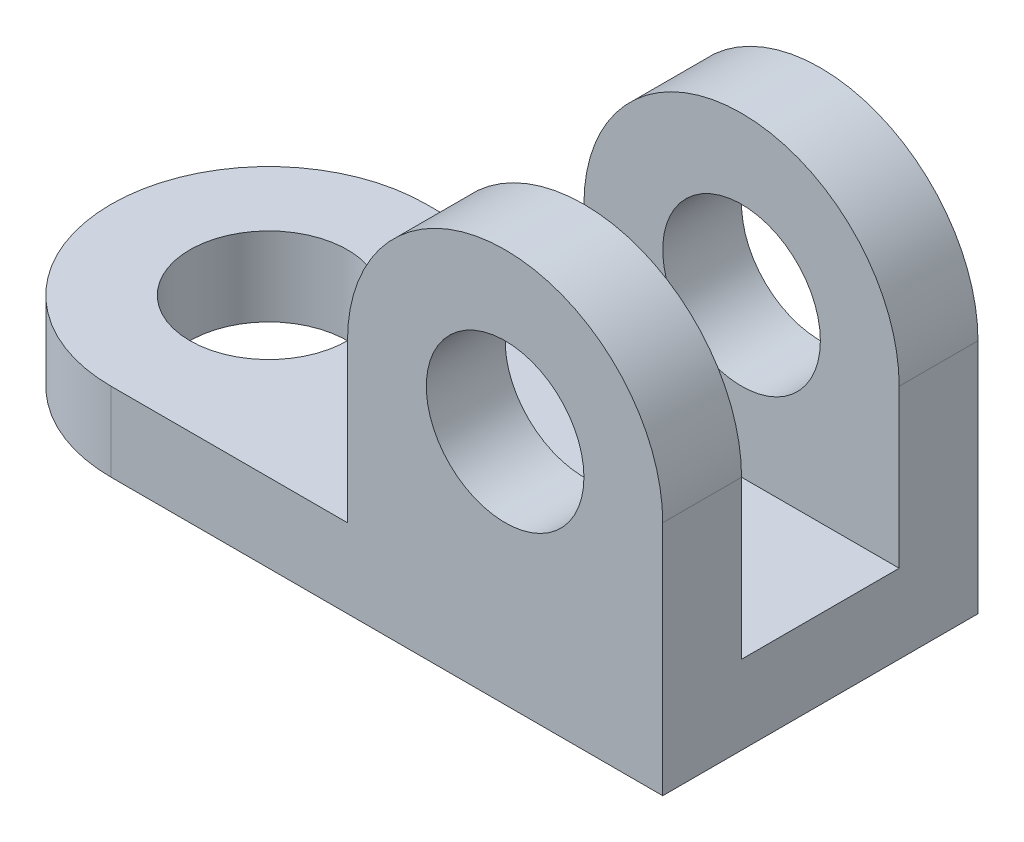
ISO-10303-21;
HEADER;
FILE_DESCRIPTION(('STEP AP214'),'2;1');
FILE_NAME('part.step','',(''),(''),'','','');
FILE_SCHEMA(('AUTOMOTIVE_DESIGN { 1 0 10303 214 1 1 1 1 }'));
ENDSEC;
DATA;
#1=APPLICATION_CONTEXT('core data for automotive mechanical design processes');
#2=APPLICATION_PROTOCOL_DEFINITION('international standard','automotive_design',2000,#1);
#3=PRODUCT_CONTEXT('',#1,'mechanical');
#4=PRODUCT('Part','Part','',(#3));
#5=PRODUCT_RELATED_PRODUCT_CATEGORY('part','',(#4));
#6=PRODUCT_DEFINITION_FORMATION('','',#4);
#7=PRODUCT_DEFINITION_CONTEXT('part definition',#1,'design');
#8=PRODUCT_DEFINITION('design','',#6,#7);
#9=PRODUCT_DEFINITION_SHAPE('','',#8);
#10=(LENGTH_UNIT() NAMED_UNIT(*) SI_UNIT(.MILLI.,.METRE.));
#11=(NAMED_UNIT(*) PLANE_ANGLE_UNIT() SI_UNIT($,.RADIAN.));
#12=(NAMED_UNIT(*) SI_UNIT($,.STERADIAN.) SOLID_ANGLE_UNIT());
#13=UNCERTAINTY_MEASURE_WITH_UNIT(LENGTH_MEASURE(1.E-05),#10,'distance_accuracy_value','');
#14=(GEOMETRIC_REPRESENTATION_CONTEXT(3) GLOBAL_UNCERTAINTY_ASSIGNED_CONTEXT((#13)) GLOBAL_UNIT_ASSIGNED_CONTEXT((#10,
#11,#12)) REPRESENTATION_CONTEXT('',''));
#15=CARTESIAN_POINT('',(0.,0.,0.));
#16=DIRECTION('',(0.,0.,1.));
#17=DIRECTION('',(1.,0.,0.));
#18=AXIS2_PLACEMENT_3D('',#15,#16,#17);
#19=CARTESIAN_POINT('',(0.,12.7,0.));
#20=DIRECTION('',(-1.,0.,0.));
#21=DIRECTION('',(0.,0.,1.));
#22=AXIS2_PLACEMENT_3D('',#19,#20,#21);
#23=PLANE('',#22);
#24=DIRECTION('',(0.,1.,0.));
#25=VECTOR('',#24,1.);
#26=CARTESIAN_POINT('',(0.,12.7,-38.1));
#27=LINE('',#26,#25);
#28=CARTESIAN_POINT('',(0.,12.7,-38.1));
#29=VERTEX_POINT('',#28);
#30=CARTESIAN_POINT('',(0.,38.1,-38.1));
#31=VERTEX_POINT('',#30);
#32=EDGE_CURVE('E122',#29,#31,#27,.T.);
#33=ORIENTED_EDGE('',*,*,#32,.F.);
#34=DIRECTION('',(0.,0.,1.));
#35=VECTOR('',#34,1.);
#36=CARTESIAN_POINT('',(0.,12.7,-38.1));
#37=LINE('',#36,#35);
#38=CARTESIAN_POINT('',(0.,12.7,-12.7));
#39=VERTEX_POINT('',#38);
#40=EDGE_CURVE('E229',#29,#39,#37,.T.);
#41=ORIENTED_EDGE('',*,*,#40,.T.);
#42=DIRECTION('',(0.,1.,0.));
#43=VECTOR('',#42,1.);
#44=CARTESIAN_POINT('',(0.,12.7,-12.7));
#45=LINE('',#44,#43);
#46=CARTESIAN_POINT('',(0.,38.1,-12.7));
#47=VERTEX_POINT('',#46);
#48=EDGE_CURVE('E127',#39,#47,#45,.T.);
#49=ORIENTED_EDGE('',*,*,#48,.T.);
#50=DIRECTION('',(0.,0.,1.));
#51=VECTOR('',#50,1.);
#52=CARTESIAN_POINT('',(0.,38.1,-50.8));
#53=LINE('',#52,#51);
#54=CARTESIAN_POINT('',(0.,38.1,0.));
#55=VERTEX_POINT('',#54);
#56=EDGE_CURVE('E209',#47,#55,#53,.T.);
#57=ORIENTED_EDGE('',*,*,#56,.T.);
#58=DIRECTION('',(0.,-1.,0.));
#59=VECTOR('',#58,1.);
#60=CARTESIAN_POINT('',(0.,12.7,0.));
#61=LINE('',#60,#59);
#62=CARTESIAN_POINT('',(0.,0.,0.));
#63=VERTEX_POINT('',#62);
#64=EDGE_CURVE('E11',#55,#63,#61,.T.);
#65=ORIENTED_EDGE('',*,*,#64,.T.);
#66=DIRECTION('',(0.,0.,-1.));
#67=VECTOR('',#66,1.);
#68=CARTESIAN_POINT('',(0.,0.,0.));
#69=LINE('',#68,#67);
#70=CARTESIAN_POINT('',(0.,0.,-50.8));
#71=VERTEX_POINT('',#70);
#72=EDGE_CURVE('E166',#63,#71,#69,.T.);
#73=ORIENTED_EDGE('',*,*,#72,.T.);
#74=DIRECTION('',(0.,-1.,0.));
#75=VECTOR('',#74,1.);
#76=CARTESIAN_POINT('',(0.,12.7,-50.8));
#77=LINE('',#76,#75);
#78=CARTESIAN_POINT('',(0.,38.1,-50.8));
#79=VERTEX_POINT('',#78);
#80=EDGE_CURVE('E47',#79,#71,#77,.T.);
#81=ORIENTED_EDGE('',*,*,#80,.F.);
#82=EDGE_CURVE('E154',#79,#31,#53,.T.);
#83=ORIENTED_EDGE('',*,*,#82,.T.);
#84=EDGE_LOOP('',(#33,#41,#49,#57,#65,#73,#81,#83));
#85=FACE_BOUND('',#84,.T.);
#86=ADVANCED_FACE('F39',(#85),#23,.F.);
#87=CARTESIAN_POINT('',(-25.4,38.1,-50.8));
#88=DIRECTION('',(0.,0.,1.));
#89=DIRECTION('',(1.,0.,0.));
#90=AXIS2_PLACEMENT_3D('',#87,#88,#89);
#91=CYLINDRICAL_SURFACE('',#90,25.4);
#92=DIRECTION('',(0.,0.,1.));
#93=VECTOR('',#92,1.);
#94=CARTESIAN_POINT('',(-50.8,38.1,-50.8));
#95=LINE('',#94,#93);
#96=CARTESIAN_POINT('',(-50.8,38.1,-50.8));
#97=VERTEX_POINT('',#96);
#98=CARTESIAN_POINT('',(-50.8,38.1,-38.1));
#99=VERTEX_POINT('',#98);
#100=EDGE_CURVE('E132',#97,#99,#95,.T.);
#101=ORIENTED_EDGE('',*,*,#100,.T.);
#102=CARTESIAN_POINT('',(-25.4,38.1,-38.1));
#103=DIRECTION('',(0.,0.,1.));
#104=DIRECTION('',(1.,0.,0.));
#105=AXIS2_PLACEMENT_3D('',#102,#103,#104);
#106=CIRCLE('',#105,25.4);
#107=EDGE_CURVE('E116',#31,#99,#106,.T.);
#108=ORIENTED_EDGE('',*,*,#107,.F.);
#109=ORIENTED_EDGE('',*,*,#82,.F.);
#110=CARTESIAN_POINT('',(-25.4,38.1,-50.8));
#111=DIRECTION('',(0.,0.,1.));
#112=DIRECTION('',(1.,0.,0.));
#113=AXIS2_PLACEMENT_3D('',#110,#111,#112);
#114=CIRCLE('',#113,25.4);
#115=EDGE_CURVE('E139',#79,#97,#114,.T.);
#116=ORIENTED_EDGE('',*,*,#115,.T.);
#117=EDGE_LOOP('',(#101,#108,#109,#116));
#118=FACE_BOUND('',#117,.T.);
#119=ADVANCED_FACE('F137',(#118),#91,.T.);
#120=CARTESIAN_POINT('',(-50.8,38.1,-50.8));
#121=DIRECTION('',(-1.,0.,0.));
#122=DIRECTION('',(0.,0.,1.));
#123=AXIS2_PLACEMENT_3D('',#120,#121,#122);
#124=PLANE('',#123);
#125=DIRECTION('',(0.,0.,1.));
#126=VECTOR('',#125,1.);
#127=CARTESIAN_POINT('',(-50.8,12.7,-50.8));
#128=LINE('',#127,#126);
#129=CARTESIAN_POINT('',(-50.8,12.7,-50.8));
#130=VERTEX_POINT('',#129);
#131=CARTESIAN_POINT('',(-50.8,12.7,-38.1));
#132=VERTEX_POINT('',#131);
#133=EDGE_CURVE('E62',#130,#132,#128,.T.);
#134=ORIENTED_EDGE('',*,*,#133,.T.);
#135=DIRECTION('',(0.,-1.,0.));
#136=VECTOR('',#135,1.);
#137=CARTESIAN_POINT('',(-50.8,38.1,-38.1));
#138=LINE('',#137,#136);
#139=EDGE_CURVE('E120',#99,#132,#138,.T.);
#140=ORIENTED_EDGE('',*,*,#139,.F.);
#141=ORIENTED_EDGE('',*,*,#100,.F.);
#142=DIRECTION('',(0.,-1.,0.));
#143=VECTOR('',#142,1.);
#144=CARTESIAN_POINT('',(-50.8,38.1,-50.8));
#145=LINE('',#144,#143);
#146=EDGE_CURVE('E144',#97,#130,#145,.T.);
#147=ORIENTED_EDGE('',*,*,#146,.T.);
#148=EDGE_LOOP('',(#134,#140,#141,#147));
#149=FACE_BOUND('',#148,.T.);
#150=ADVANCED_FACE('F130',(#149),#124,.T.);
#151=CARTESIAN_POINT('',(-25.4,38.1,-50.8));
#152=DIRECTION('',(0.,0.,1.));
#153=DIRECTION('',(1.,0.,0.));
#154=AXIS2_PLACEMENT_3D('',#151,#152,#153);
#155=CYLINDRICAL_SURFACE('',#154,12.7);
#156=CARTESIAN_POINT('',(-25.4,38.1,-50.8));
#157=DIRECTION('',(0.,0.,1.));
#158=DIRECTION('',(1.,0.,0.));
#159=AXIS2_PLACEMENT_3D('',#156,#157,#158);
#160=CIRCLE('',#159,12.7);
#161=CARTESIAN_POINT('',(-12.7,38.1,-50.8));
#162=VERTEX_POINT('',#161);
#163=EDGE_CURVE('E208',#162,#162,#160,.T.);
#164=CARTESIAN_POINT('',(-25.4,38.1,-38.1));
#165=DIRECTION('',(0.,0.,1.));
#166=DIRECTION('',(1.,0.,0.));
#167=AXIS2_PLACEMENT_3D('',#164,#165,#166);
#168=CIRCLE('',#167,12.7);
#169=CARTESIAN_POINT('',(-12.7,38.1,-38.1));
#170=VERTEX_POINT('',#169);
#171=EDGE_CURVE('E224',#170,#170,#168,.T.);
#172=CARTESIAN_POINT('',(-12.7,38.1,-50.8));
#173=CARTESIAN_POINT('',(-12.7,38.1,-50.6677083333333));
#174=CARTESIAN_POINT('',(-12.7,38.1,-50.5354166666667));
#175=CARTESIAN_POINT('',(-12.7,38.1,-50.2708333333333));
#176=CARTESIAN_POINT('',(-12.7,38.1,-50.1385416666667));
#177=CARTESIAN_POINT('',(-12.7,38.1,-49.8739583333333));
#178=CARTESIAN_POINT('',(-12.7,38.1,-49.7416666666667));
#179=CARTESIAN_POINT('',(-12.7,38.1,-49.4770833333333));
#180=CARTESIAN_POINT('',(-12.7,38.1,-49.3447916666667));
#181=CARTESIAN_POINT('',(-12.7,38.1,-49.0802083333333));
#182=CARTESIAN_POINT('',(-12.7,38.1,-48.9479166666667));
#183=CARTESIAN_POINT('',(-12.7,38.1,-48.6833333333333));
#184=CARTESIAN_POINT('',(-12.7,38.1,-48.5510416666667));
#185=CARTESIAN_POINT('',(-12.7,38.1,-48.2864583333333));
#186=CARTESIAN_POINT('',(-12.7,38.1,-48.1541666666667));
#187=CARTESIAN_POINT('',(-12.7,38.1,-47.8895833333333));
#188=CARTESIAN_POINT('',(-12.7,38.1,-47.7572916666667));
#189=CARTESIAN_POINT('',(-12.7,38.1,-47.4927083333333));
#190=CARTESIAN_POINT('',(-12.7,38.1,-47.3604166666667));
#191=CARTESIAN_POINT('',(-12.7,38.1,-47.0958333333333));
#192=CARTESIAN_POINT('',(-12.7,38.1,-46.9635416666667));
#193=CARTESIAN_POINT('',(-12.7,38.1,-46.6989583333333));
#194=CARTESIAN_POINT('',(-12.7,38.1,-46.5666666666667));
#195=CARTESIAN_POINT('',(-12.7,38.1,-46.3020833333333));
#196=CARTESIAN_POINT('',(-12.7,38.1,-46.1697916666667));
#197=CARTESIAN_POINT('',(-12.7,38.1,-45.9052083333333));
#198=CARTESIAN_POINT('',(-12.7,38.1,-45.7729166666667));
#199=CARTESIAN_POINT('',(-12.7,38.1,-45.5083333333333));
#200=CARTESIAN_POINT('',(-12.7,38.1,-45.3760416666667));
#201=CARTESIAN_POINT('',(-12.7,38.1,-45.1114583333333));
#202=CARTESIAN_POINT('',(-12.7,38.1,-44.9791666666667));
#203=CARTESIAN_POINT('',(-12.7,38.1,-44.7145833333333));
#204=CARTESIAN_POINT('',(-12.7,38.1,-44.5822916666667));
#205=CARTESIAN_POINT('',(-12.7,38.1,-44.3177083333333));
#206=CARTESIAN_POINT('',(-12.7,38.1,-44.1854166666667));
#207=CARTESIAN_POINT('',(-12.7,38.1,-43.9208333333333));
#208=CARTESIAN_POINT('',(-12.7,38.1,-43.7885416666667));
#209=CARTESIAN_POINT('',(-12.7,38.1,-43.5239583333333));
#210=CARTESIAN_POINT('',(-12.7,38.1,-43.3916666666667));
#211=CARTESIAN_POINT('',(-12.7,38.1,-43.1270833333333));
#212=CARTESIAN_POINT('',(-12.7,38.1,-42.9947916666667));
#213=CARTESIAN_POINT('',(-12.7,38.1,-42.7302083333333));
#214=CARTESIAN_POINT('',(-12.7,38.1,-42.5979166666667));
#215=CARTESIAN_POINT('',(-12.7,38.1,-42.3333333333333));
#216=CARTESIAN_POINT('',(-12.7,38.1,-42.2010416666667));
#217=CARTESIAN_POINT('',(-12.7,38.1,-41.9364583333333));
#218=CARTESIAN_POINT('',(-12.7,38.1,-41.8041666666667));
#219=CARTESIAN_POINT('',(-12.7,38.1,-41.5395833333333));
#220=CARTESIAN_POINT('',(-12.7,38.1,-41.4072916666667));
#221=CARTESIAN_POINT('',(-12.7,38.1,-41.1427083333333));
#222=CARTESIAN_POINT('',(-12.7,38.1,-41.0104166666667));
#223=CARTESIAN_POINT('',(-12.7,38.1,-40.7458333333333));
#224=CARTESIAN_POINT('',(-12.7,38.1,-40.6135416666667));
#225=CARTESIAN_POINT('',(-12.7,38.1,-40.3489583333333));
#226=CARTESIAN_POINT('',(-12.7,38.1,-40.2166666666667));
#227=CARTESIAN_POINT('',(-12.7,38.1,-39.9520833333333));
#228=CARTESIAN_POINT('',(-12.7,38.1,-39.8197916666667));
#229=CARTESIAN_POINT('',(-12.7,38.1,-39.5552083333333));
#230=CARTESIAN_POINT('',(-12.7,38.1,-39.4229166666667));
#231=CARTESIAN_POINT('',(-12.7,38.1,-39.1583333333333));
#232=CARTESIAN_POINT('',(-12.7,38.1,-39.0260416666667));
#233=CARTESIAN_POINT('',(-12.7,38.1,-38.7614583333333));
#234=CARTESIAN_POINT('',(-12.7,38.1,-38.6291666666667));
#235=CARTESIAN_POINT('',(-12.7,38.1,-38.3645833333333));
#236=CARTESIAN_POINT('',(-12.7,38.1,-38.2322916666667));
#237=CARTESIAN_POINT('',(-12.7,38.1,-38.1));
#238=B_SPLINE_CURVE_WITH_KNOTS('',3,(#172,#173,#174,#175,#176,#177,#178,#179,#180,#181,#182,
#183,#184,#185,#186,#187,#188,#189,#190,#191,#192,#193,#194,#195,#196,#197,#198,#199,#200,#201,
#202,#203,#204,#205,#206,#207,#208,#209,#210,#211,#212,#213,#214,#215,#216,#217,#218,#219,#220,
#221,#222,#223,#224,#225,#226,#227,#228,#229,#230,#231,#232,#233,#234,#235,#236,#237),
.UNSPECIFIED.,.F.,.F.,(4,2,2,2,2,2,2,2,2,2,2,2,2,2,2,2,2,2,2,2,2,2,2,2,2,2,2,2,2,2,2,2,4),(0.,
0.396874999999998,0.793749999999996,1.19062499999999,1.5875,1.984375,2.38124999999999,2.778125,
3.175,3.571875,3.96875,4.365625,4.7625,5.159375,5.55625,5.953125,6.35,6.746875,7.14375,7.540625,
7.9375,8.334375,8.73125,9.128125,9.525,9.921875,10.31875,10.715625,11.1125,11.509375,11.90625,
12.303125,12.7),.UNSPECIFIED.);
#239=EDGE_CURVE('BSEAM256',#162,#170,#238,.T.);
#240=ORIENTED_EDGE('',*,*,#163,.F.);
#241=ORIENTED_EDGE('',*,*,#171,.T.);
#242=ORIENTED_EDGE('',*,*,#239,.T.);
#243=ORIENTED_EDGE('',*,*,#239,.F.);
#244=EDGE_LOOP('',(#240,#242,#241,#243));
#245=FACE_BOUND('',#244,.T.);
#246=ADVANCED_FACE('F256',(#245),#155,.F.);
#247=CARTESIAN_POINT('',(-88.9,12.7,-25.4));
#248=DIRECTION('',(0.,1.,0.));
#249=DIRECTION('',(0.,0.,1.));
#250=AXIS2_PLACEMENT_3D('',#247,#248,#249);
#251=PLANE('',#250);
#252=ORIENTED_EDGE('',*,*,#133,.F.);
#253=DIRECTION('',(-1.,0.,0.));
#254=VECTOR('',#253,1.);
#255=CARTESIAN_POINT('',(0.,12.7,-50.8));
#256=LINE('',#255,#254);
#257=CARTESIAN_POINT('',(-88.9,12.7,-50.8));
#258=VERTEX_POINT('',#257);
#259=EDGE_CURVE('E158',#130,#258,#256,.T.);
#260=ORIENTED_EDGE('',*,*,#259,.T.);
#261=CARTESIAN_POINT('',(-88.9,12.7,-25.4));
#262=DIRECTION('',(0.,1.,0.));
#263=DIRECTION('',(0.,0.,1.));
#264=AXIS2_PLACEMENT_3D('',#261,#262,#263);
#265=CIRCLE('',#264,25.4);
#266=CARTESIAN_POINT('',(-88.9,12.7,0.));
#267=VERTEX_POINT('',#266);
#268=EDGE_CURVE('E161',#258,#267,#265,.T.);
#269=ORIENTED_EDGE('',*,*,#268,.T.);
#270=DIRECTION('',(1.,0.,0.));
#271=VECTOR('',#270,1.);
#272=CARTESIAN_POINT('',(-88.9,12.7,0.));
#273=LINE('',#272,#271);
#274=CARTESIAN_POINT('',(-50.8,12.7,0.));
#275=VERTEX_POINT('',#274);
#276=EDGE_CURVE('E155',#267,#275,#273,.T.);
#277=ORIENTED_EDGE('',*,*,#276,.T.);
#278=CARTESIAN_POINT('',(-50.8,12.7,-12.7));
#279=VERTEX_POINT('',#278);
#280=EDGE_CURVE('E140',#279,#275,#128,.T.);
#281=ORIENTED_EDGE('',*,*,#280,.F.);
#282=DIRECTION('',(1.,0.,0.));
#283=VECTOR('',#282,1.);
#284=CARTESIAN_POINT('',(-50.8,12.7,-12.7));
#285=LINE('',#284,#283);
#286=EDGE_CURVE('E54',#279,#39,#285,.T.);
#287=ORIENTED_EDGE('',*,*,#286,.T.);
#288=ORIENTED_EDGE('',*,*,#40,.F.);
#289=DIRECTION('',(1.,0.,0.));
#290=VECTOR('',#289,1.);
#291=CARTESIAN_POINT('',(-50.8,12.7,-38.1));
#292=LINE('',#291,#290);
#293=EDGE_CURVE('E134',#132,#29,#292,.T.);
#294=ORIENTED_EDGE('',*,*,#293,.F.);
#295=EDGE_LOOP('',(#252,#260,#269,#277,#281,#287,#288,#294));
#296=FACE_BOUND('',#295,.T.);
#297=CARTESIAN_POINT('',(-88.9,12.7,-25.4));
#298=DIRECTION('',(0.,1.,0.));
#299=DIRECTION('',(0.,0.,1.));
#300=AXIS2_PLACEMENT_3D('',#297,#298,#299);
#301=CIRCLE('',#300,12.7);
#302=CARTESIAN_POINT('',(-88.9,12.7,-12.7));
#303=VERTEX_POINT('',#302);
#304=EDGE_CURVE('E147',#303,#303,#301,.T.);
#305=ORIENTED_EDGE('',*,*,#304,.F.);
#306=EDGE_LOOP('',(#305));
#307=FACE_BOUND('',#306,.T.);
#308=ADVANCED_FACE('F200',(#296,#307),#251,.T.);
#309=CARTESIAN_POINT('',(-88.9,0.,-25.4));
#310=DIRECTION('',(0.,1.,0.));
#311=DIRECTION('',(0.,0.,1.));
#312=AXIS2_PLACEMENT_3D('',#309,#310,#311);
#313=PLANE('',#312);
#314=DIRECTION('',(1.,0.,0.));
#315=VECTOR('',#314,1.);
#316=CARTESIAN_POINT('',(-88.9,0.,0.));
#317=LINE('',#316,#315);
#318=CARTESIAN_POINT('',(-88.9,0.,0.));
#319=VERTEX_POINT('',#318);
#320=EDGE_CURVE('E150',#319,#63,#317,.T.);
#321=ORIENTED_EDGE('',*,*,#320,.F.);
#322=CARTESIAN_POINT('',(-88.9,0.,-25.4));
#323=DIRECTION('',(0.,1.,0.));
#324=DIRECTION('',(0.,0.,1.));
#325=AXIS2_PLACEMENT_3D('',#322,#323,#324);
#326=CIRCLE('',#325,25.4);
#327=CARTESIAN_POINT('',(-88.9,0.,-50.8));
#328=VERTEX_POINT('',#327);
#329=EDGE_CURVE('E159',#328,#319,#326,.T.);
#330=ORIENTED_EDGE('',*,*,#329,.F.);
#331=DIRECTION('',(-1.,0.,0.));
#332=VECTOR('',#331,1.);
#333=CARTESIAN_POINT('',(0.,0.,-50.8));
#334=LINE('',#333,#332);
#335=EDGE_CURVE('E168',#71,#328,#334,.T.);
#336=ORIENTED_EDGE('',*,*,#335,.F.);
#337=ORIENTED_EDGE('',*,*,#72,.F.);
#338=EDGE_LOOP('',(#321,#330,#336,#337));
#339=FACE_BOUND('',#338,.T.);
#340=CARTESIAN_POINT('',(-88.9,0.,-25.4));
#341=DIRECTION('',(0.,1.,0.));
#342=DIRECTION('',(0.,0.,1.));
#343=AXIS2_PLACEMENT_3D('',#340,#341,#342);
#344=CIRCLE('',#343,12.7);
#345=CARTESIAN_POINT('',(-88.9,0.,-12.7));
#346=VERTEX_POINT('',#345);
#347=EDGE_CURVE('E151',#346,#346,#344,.T.);
#348=ORIENTED_EDGE('',*,*,#347,.T.);
#349=EDGE_LOOP('',(#348));
#350=FACE_BOUND('',#349,.T.);
#351=ADVANCED_FACE('F185',(#339,#350),#313,.F.);
#352=CARTESIAN_POINT('',(-88.9,12.7,0.));
#353=DIRECTION('',(0.,0.,-1.));
#354=DIRECTION('',(-1.,0.,0.));
#355=AXIS2_PLACEMENT_3D('',#352,#353,#354);
#356=PLANE('',#355);
#357=ORIENTED_EDGE('',*,*,#320,.T.);
#358=ORIENTED_EDGE('',*,*,#64,.F.);
#359=CARTESIAN_POINT('',(-25.4,38.1,0.));
#360=DIRECTION('',(0.,0.,1.));
#361=DIRECTION('',(1.,0.,0.));
#362=AXIS2_PLACEMENT_3D('',#359,#360,#361);
#363=CIRCLE('',#362,25.4);
#364=CARTESIAN_POINT('',(-50.8,38.1,0.));
#365=VERTEX_POINT('',#364);
#366=EDGE_CURVE('E206',#55,#365,#363,.T.);
#367=ORIENTED_EDGE('',*,*,#366,.T.);
#368=DIRECTION('',(0.,-1.,0.));
#369=VECTOR('',#368,1.);
#370=CARTESIAN_POINT('',(-50.8,38.1,0.));
#371=LINE('',#370,#369);
#372=EDGE_CURVE('E198',#365,#275,#371,.T.);
#373=ORIENTED_EDGE('',*,*,#372,.T.);
#374=ORIENTED_EDGE('',*,*,#276,.F.);
#375=DIRECTION('',(0.,-1.,0.));
#376=VECTOR('',#375,1.);
#377=CARTESIAN_POINT('',(-88.9,12.7,0.));
#378=LINE('',#377,#376);
#379=EDGE_CURVE('E163',#267,#319,#378,.T.);
#380=ORIENTED_EDGE('',*,*,#379,.T.);
#381=EDGE_LOOP('',(#357,#358,#367,#373,#374,#380));
#382=FACE_BOUND('',#381,.T.);
#383=CARTESIAN_POINT('',(-25.4,38.1,0.));
#384=DIRECTION('',(0.,0.,1.));
#385=DIRECTION('',(1.,0.,0.));
#386=AXIS2_PLACEMENT_3D('',#383,#384,#385);
#387=CIRCLE('',#386,12.7);
#388=CARTESIAN_POINT('',(-12.7,38.1,0.));
#389=VERTEX_POINT('',#388);
#390=EDGE_CURVE('E231',#389,#389,#387,.T.);
#391=ORIENTED_EDGE('',*,*,#390,.F.);
#392=EDGE_LOOP('',(#391));
#393=FACE_BOUND('',#392,.T.);
#394=ADVANCED_FACE('F41',(#382,#393),#356,.F.);
#395=CARTESIAN_POINT('',(0.,12.7,-50.8));
#396=DIRECTION('',(0.,0.,1.));
#397=DIRECTION('',(1.,0.,0.));
#398=AXIS2_PLACEMENT_3D('',#395,#396,#397);
#399=PLANE('',#398);
#400=ORIENTED_EDGE('',*,*,#335,.T.);
#401=DIRECTION('',(0.,-1.,0.));
#402=VECTOR('',#401,1.);
#403=CARTESIAN_POINT('',(-88.9,12.7,-50.8));
#404=LINE('',#403,#402);
#405=EDGE_CURVE('E173',#258,#328,#404,.T.);
#406=ORIENTED_EDGE('',*,*,#405,.F.);
#407=ORIENTED_EDGE('',*,*,#259,.F.);
#408=ORIENTED_EDGE('',*,*,#146,.F.);
#409=ORIENTED_EDGE('',*,*,#115,.F.);
#410=ORIENTED_EDGE('',*,*,#80,.T.);
#411=EDGE_LOOP('',(#400,#406,#407,#408,#409,#410));
#412=FACE_BOUND('',#411,.T.);
#413=ORIENTED_EDGE('',*,*,#163,.T.);
#414=EDGE_LOOP('',(#413));
#415=FACE_BOUND('',#414,.T.);
#416=ADVANCED_FACE('F178',(#412,#415),#399,.F.);
#417=CARTESIAN_POINT('',(-88.9,12.7,-25.4));
#418=DIRECTION('',(0.,-1.,0.));
#419=DIRECTION('',(0.,0.,-1.));
#420=AXIS2_PLACEMENT_3D('',#417,#418,#419);
#421=CYLINDRICAL_SURFACE('',#420,25.4);
#422=ORIENTED_EDGE('',*,*,#329,.T.);
#423=ORIENTED_EDGE('',*,*,#379,.F.);
#424=ORIENTED_EDGE('',*,*,#268,.F.);
#425=ORIENTED_EDGE('',*,*,#405,.T.);
#426=EDGE_LOOP('',(#422,#423,#424,#425));
#427=FACE_BOUND('',#426,.T.);
#428=ADVANCED_FACE('F189',(#427),#421,.T.);
#429=CARTESIAN_POINT('',(-88.9,12.7,-25.4));
#430=DIRECTION('',(0.,-1.,0.));
#431=DIRECTION('',(0.,0.,-1.));
#432=AXIS2_PLACEMENT_3D('',#429,#430,#431);
#433=CYLINDRICAL_SURFACE('',#432,12.7);
#434=ORIENTED_EDGE('',*,*,#304,.T.);
#435=EDGE_LOOP('',(#434));
#436=FACE_BOUND('',#435,.T.);
#437=ORIENTED_EDGE('',*,*,#347,.F.);
#438=EDGE_LOOP('',(#437));
#439=FACE_BOUND('',#438,.T.);
#440=ADVANCED_FACE('F252',(#436,#439),#433,.F.);
#441=CARTESIAN_POINT('',(-25.4,38.1,-12.7));
#442=DIRECTION('',(0.,0.,1.));
#443=DIRECTION('',(1.,0.,0.));
#444=AXIS2_PLACEMENT_3D('',#441,#442,#443);
#445=CIRCLE('',#444,25.4);
#446=CARTESIAN_POINT('',(-50.8,38.1,-12.7));
#447=VERTEX_POINT('',#446);
#448=EDGE_CURVE('E218',#47,#447,#445,.T.);
#449=ORIENTED_EDGE('',*,*,#448,.T.);
#450=EDGE_CURVE('E141',#447,#365,#95,.T.);
#451=ORIENTED_EDGE('',*,*,#450,.T.);
#452=ORIENTED_EDGE('',*,*,#366,.F.);
#453=ORIENTED_EDGE('',*,*,#56,.F.);
#454=EDGE_LOOP('',(#449,#451,#452,#453));
#455=FACE_BOUND('',#454,.T.);
#456=ADVANCED_FACE('F216',(#455),#91,.T.);
#457=DIRECTION('',(0.,-1.,0.));
#458=VECTOR('',#457,1.);
#459=CARTESIAN_POINT('',(-50.8,38.1,-12.7));
#460=LINE('',#459,#458);
#461=EDGE_CURVE('E221',#447,#279,#460,.T.);
#462=ORIENTED_EDGE('',*,*,#461,.T.);
#463=ORIENTED_EDGE('',*,*,#280,.T.);
#464=ORIENTED_EDGE('',*,*,#372,.F.);
#465=ORIENTED_EDGE('',*,*,#450,.F.);
#466=EDGE_LOOP('',(#462,#463,#464,#465));
#467=FACE_BOUND('',#466,.T.);
#468=ADVANCED_FACE('F220',(#467),#124,.T.);
#469=CARTESIAN_POINT('',(-25.4,38.1,-12.7));
#470=DIRECTION('',(0.,0.,1.));
#471=DIRECTION('',(1.,0.,0.));
#472=AXIS2_PLACEMENT_3D('',#469,#470,#471);
#473=CIRCLE('',#472,12.7);
#474=CARTESIAN_POINT('',(-12.7,38.1,-12.7));
#475=VERTEX_POINT('',#474);
#476=EDGE_CURVE('E276',#475,#475,#473,.T.);
#477=CARTESIAN_POINT('',(-12.7,38.1,-12.7));
#478=CARTESIAN_POINT('',(-12.7,38.1,-12.5677083333333));
#479=CARTESIAN_POINT('',(-12.7,38.1,-12.4354166666667));
#480=CARTESIAN_POINT('',(-12.7,38.1,-12.1708333333333));
#481=CARTESIAN_POINT('',(-12.7,38.1,-12.0385416666667));
#482=CARTESIAN_POINT('',(-12.7,38.1,-11.7739583333333));
#483=CARTESIAN_POINT('',(-12.7,38.1,-11.6416666666667));
#484=CARTESIAN_POINT('',(-12.7,38.1,-11.3770833333333));
#485=CARTESIAN_POINT('',(-12.7,38.1,-11.2447916666667));
#486=CARTESIAN_POINT('',(-12.7,38.1,-10.9802083333333));
#487=CARTESIAN_POINT('',(-12.7,38.1,-10.8479166666667));
#488=CARTESIAN_POINT('',(-12.7,38.1,-10.5833333333333));
#489=CARTESIAN_POINT('',(-12.7,38.1,-10.4510416666667));
#490=CARTESIAN_POINT('',(-12.7,38.1,-10.1864583333333));
#491=CARTESIAN_POINT('',(-12.7,38.1,-10.0541666666667));
#492=CARTESIAN_POINT('',(-12.7,38.1,-9.78958333333334));
#493=CARTESIAN_POINT('',(-12.7,38.1,-9.65729166666667));
#494=CARTESIAN_POINT('',(-12.7,38.1,-9.39270833333334));
#495=CARTESIAN_POINT('',(-12.7,38.1,-9.26041666666667));
#496=CARTESIAN_POINT('',(-12.7,38.1,-8.99583333333334));
#497=CARTESIAN_POINT('',(-12.7,38.1,-8.86354166666667));
#498=CARTESIAN_POINT('',(-12.7,38.1,-8.59895833333334));
#499=CARTESIAN_POINT('',(-12.7,38.1,-8.46666666666667));
#500=CARTESIAN_POINT('',(-12.7,38.1,-8.20208333333334));
#501=CARTESIAN_POINT('',(-12.7,38.1,-8.06979166666667));
#502=CARTESIAN_POINT('',(-12.7,38.1,-7.80520833333333));
#503=CARTESIAN_POINT('',(-12.7,38.1,-7.67291666666667));
#504=CARTESIAN_POINT('',(-12.7,38.1,-7.40833333333334));
#505=CARTESIAN_POINT('',(-12.7,38.1,-7.27604166666667));
#506=CARTESIAN_POINT('',(-12.7,38.1,-7.01145833333334));
#507=CARTESIAN_POINT('',(-12.7,38.1,-6.87916666666667));
#508=CARTESIAN_POINT('',(-12.7,38.1,-6.61458333333333));
#509=CARTESIAN_POINT('',(-12.7,38.1,-6.48229166666667));
#510=CARTESIAN_POINT('',(-12.7,38.1,-6.21770833333334));
#511=CARTESIAN_POINT('',(-12.7,38.1,-6.08541666666667));
#512=CARTESIAN_POINT('',(-12.7,38.1,-5.82083333333333));
#513=CARTESIAN_POINT('',(-12.7,38.1,-5.68854166666667));
#514=CARTESIAN_POINT('',(-12.7,38.1,-5.42395833333333));
#515=CARTESIAN_POINT('',(-12.7,38.1,-5.29166666666667));
#516=CARTESIAN_POINT('',(-12.7,38.1,-5.02708333333333));
#517=CARTESIAN_POINT('',(-12.7,38.1,-4.89479166666667));
#518=CARTESIAN_POINT('',(-12.7,38.1,-4.63020833333333));
#519=CARTESIAN_POINT('',(-12.7,38.1,-4.49791666666667));
#520=CARTESIAN_POINT('',(-12.7,38.1,-4.23333333333333));
#521=CARTESIAN_POINT('',(-12.7,38.1,-4.10104166666667));
#522=CARTESIAN_POINT('',(-12.7,38.1,-3.83645833333333));
#523=CARTESIAN_POINT('',(-12.7,38.1,-3.70416666666667));
#524=CARTESIAN_POINT('',(-12.7,38.1,-3.43958333333333));
#525=CARTESIAN_POINT('',(-12.7,38.1,-3.30729166666667));
#526=CARTESIAN_POINT('',(-12.7,38.1,-3.04270833333333));
#527=CARTESIAN_POINT('',(-12.7,38.1,-2.91041666666667));
#528=CARTESIAN_POINT('',(-12.7,38.1,-2.64583333333333));
#529=CARTESIAN_POINT('',(-12.7,38.1,-2.51354166666667));
#530=CARTESIAN_POINT('',(-12.7,38.1,-2.24895833333333));
#531=CARTESIAN_POINT('',(-12.7,38.1,-2.11666666666666));
#532=CARTESIAN_POINT('',(-12.7,38.1,-1.85208333333333));
#533=CARTESIAN_POINT('',(-12.7,38.1,-1.71979166666666));
#534=CARTESIAN_POINT('',(-12.7,38.1,-1.45520833333333));
#535=CARTESIAN_POINT('',(-12.7,38.1,-1.32291666666667));
#536=CARTESIAN_POINT('',(-12.7,38.1,-1.05833333333333));
#537=CARTESIAN_POINT('',(-12.7,38.1,-0.926041666666664));
#538=CARTESIAN_POINT('',(-12.7,38.1,-0.66145833333333));
#539=CARTESIAN_POINT('',(-12.7,38.1,-0.529166666666664));
#540=CARTESIAN_POINT('',(-12.7,38.1,-0.264583333333332));
#541=CARTESIAN_POINT('',(-12.7,38.1,-0.132291666666666));
#542=CARTESIAN_POINT('',(-12.7,38.1,0.));
#543=B_SPLINE_CURVE_WITH_KNOTS('',3,(#477,#478,#479,#480,#481,#482,#483,#484,#485,#486,#487,
#488,#489,#490,#491,#492,#493,#494,#495,#496,#497,#498,#499,#500,#501,#502,#503,#504,#505,#506,
#507,#508,#509,#510,#511,#512,#513,#514,#515,#516,#517,#518,#519,#520,#521,#522,#523,#524,#525,
#526,#527,#528,#529,#530,#531,#532,#533,#534,#535,#536,#537,#538,#539,#540,#541,#542),
.UNSPECIFIED.,.F.,.F.,(4,2,2,2,2,2,2,2,2,2,2,2,2,2,2,2,2,2,2,2,2,2,2,2,2,2,2,2,2,2,2,2,4),(0.,
0.396874999999998,0.793750000000003,1.190625,1.5875,1.984375,2.38125,2.778125,3.175,3.571875,
3.96875,4.365625,4.7625,5.159375,5.55625,5.953125,6.35,6.746875,7.14375,7.540625,7.9375,
8.334375,8.73125,9.128125,9.52500000000001,9.921875,10.31875,10.715625,11.1125,11.509375,
11.90625,12.303125,12.7),.UNSPECIFIED.);
#544=EDGE_CURVE('BSEAM236',#475,#389,#543,.T.);
#545=ORIENTED_EDGE('',*,*,#476,.F.);
#546=ORIENTED_EDGE('',*,*,#390,.T.);
#547=ORIENTED_EDGE('',*,*,#544,.T.);
#548=ORIENTED_EDGE('',*,*,#544,.F.);
#549=EDGE_LOOP('',(#545,#547,#546,#548));
#550=FACE_BOUND('',#549,.T.);
#551=ADVANCED_FACE('F236',(#550),#155,.F.);
#552=CARTESIAN_POINT('',(-25.4,38.1,-38.1));
#553=DIRECTION('',(0.,0.,1.));
#554=DIRECTION('',(1.,0.,0.));
#555=AXIS2_PLACEMENT_3D('',#552,#553,#554);
#556=PLANE('',#555);
#557=ORIENTED_EDGE('',*,*,#171,.F.);
#558=EDGE_LOOP('',(#557));
#559=FACE_BOUND('',#558,.T.);
#560=ORIENTED_EDGE('',*,*,#107,.T.);
#561=ORIENTED_EDGE('',*,*,#139,.T.);
#562=ORIENTED_EDGE('',*,*,#293,.T.);
#563=ORIENTED_EDGE('',*,*,#32,.T.);
#564=EDGE_LOOP('',(#560,#561,#562,#563));
#565=FACE_BOUND('',#564,.T.);
#566=ADVANCED_FACE('F118',(#559,#565),#556,.T.);
#567=CARTESIAN_POINT('',(-25.4,38.1,-12.7));
#568=DIRECTION('',(0.,0.,1.));
#569=DIRECTION('',(1.,0.,0.));
#570=AXIS2_PLACEMENT_3D('',#567,#568,#569);
#571=PLANE('',#570);
#572=ORIENTED_EDGE('',*,*,#476,.T.);
#573=EDGE_LOOP('',(#572));
#574=FACE_BOUND('',#573,.T.);
#575=ORIENTED_EDGE('',*,*,#448,.F.);
#576=ORIENTED_EDGE('',*,*,#48,.F.);
#577=ORIENTED_EDGE('',*,*,#286,.F.);
#578=ORIENTED_EDGE('',*,*,#461,.F.);
#579=EDGE_LOOP('',(#575,#576,#577,#578));
#580=FACE_BOUND('',#579,.T.);
#581=ADVANCED_FACE('F265',(#574,#580),#571,.F.);
#582=CLOSED_SHELL('',(#86,#119,#150,#246,#308,#351,#394,#416,#428,#440,#456,#468,#551,#566,#581));
#583=MANIFOLD_SOLID_BREP('B2',#582);
#584=ADVANCED_BREP_SHAPE_REPRESENTATION('',(#18,#583),#14);
#585=SHAPE_DEFINITION_REPRESENTATION(#9,#584);
ENDSEC;
END-ISO-10303-21;
